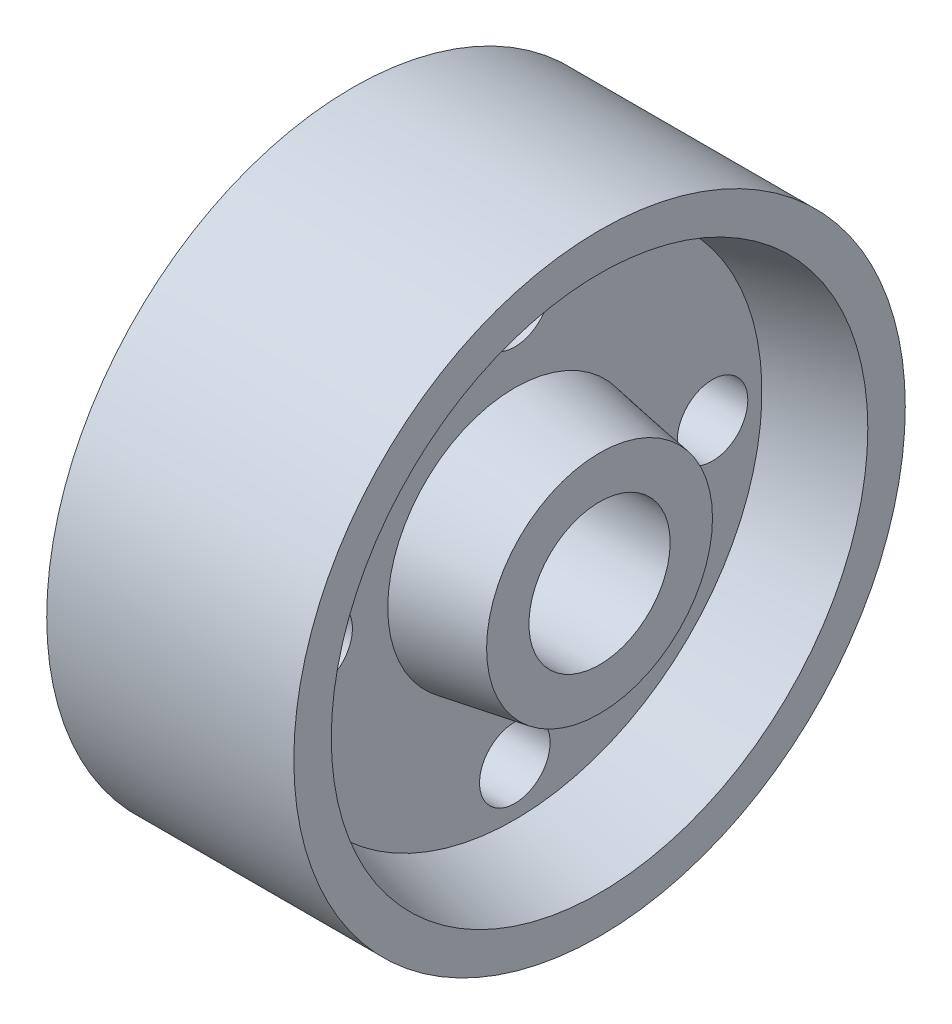
ISO-10303-21;
HEADER;
FILE_DESCRIPTION(('STEP AP214'),'2;1');
FILE_NAME('part.step','',(''),(''),'','','');
FILE_SCHEMA(('AUTOMOTIVE_DESIGN { 1 0 10303 214 1 1 1 1 }'));
ENDSEC;
DATA;
#1=APPLICATION_CONTEXT('core data for automotive mechanical design processes');
#2=APPLICATION_PROTOCOL_DEFINITION('international standard','automotive_design',2000,#1);
#3=PRODUCT_CONTEXT('',#1,'mechanical');
#4=PRODUCT('Part','Part','',(#3));
#5=PRODUCT_RELATED_PRODUCT_CATEGORY('part','',(#4));
#6=PRODUCT_DEFINITION_FORMATION('','',#4);
#7=PRODUCT_DEFINITION_CONTEXT('part definition',#1,'design');
#8=PRODUCT_DEFINITION('design','',#6,#7);
#9=PRODUCT_DEFINITION_SHAPE('','',#8);
#10=(LENGTH_UNIT() NAMED_UNIT(*) SI_UNIT(.MILLI.,.METRE.));
#11=(NAMED_UNIT(*) PLANE_ANGLE_UNIT() SI_UNIT($,.RADIAN.));
#12=(NAMED_UNIT(*) SI_UNIT($,.STERADIAN.) SOLID_ANGLE_UNIT());
#13=UNCERTAINTY_MEASURE_WITH_UNIT(LENGTH_MEASURE(1.E-05),#10,'distance_accuracy_value','');
#14=(GEOMETRIC_REPRESENTATION_CONTEXT(3) GLOBAL_UNCERTAINTY_ASSIGNED_CONTEXT((#13)) GLOBAL_UNIT_ASSIGNED_CONTEXT((#10,
#11,#12)) REPRESENTATION_CONTEXT('',''));
#15=CARTESIAN_POINT('',(0.,0.,0.));
#16=DIRECTION('',(0.,0.,1.));
#17=DIRECTION('',(1.,0.,0.));
#18=AXIS2_PLACEMENT_3D('',#15,#16,#17);
#19=CARTESIAN_POINT('',(35.,0.,0.));
#20=DIRECTION('',(-1.,0.,0.));
#21=DIRECTION('',(0.,0.,1.));
#22=AXIS2_PLACEMENT_3D('',#19,#20,#21);
#23=PLANE('',#22);
#24=CARTESIAN_POINT('',(35.,0.,0.));
#25=DIRECTION('',(1.,0.,0.));
#26=DIRECTION('',(0.,0.,-1.));
#27=AXIS2_PLACEMENT_3D('',#24,#25,#26);
#28=CIRCLE('',#27,10.);
#29=CARTESIAN_POINT('',(35.,0.,-10.));
#30=VERTEX_POINT('',#29);
#31=EDGE_CURVE('E186',#30,#30,#28,.T.);
#32=ORIENTED_EDGE('',*,*,#31,.F.);
#33=EDGE_LOOP('',(#32));
#34=FACE_BOUND('',#33,.T.);
#35=CARTESIAN_POINT('',(35.,0.,0.));
#36=DIRECTION('',(-1.,0.,0.));
#37=DIRECTION('',(0.,0.,1.));
#38=AXIS2_PLACEMENT_3D('',#35,#36,#37);
#39=CIRCLE('',#38,16.);
#40=CARTESIAN_POINT('',(35.,0.,16.));
#41=VERTEX_POINT('',#40);
#42=EDGE_CURVE('E10',#41,#41,#39,.T.);
#43=ORIENTED_EDGE('',*,*,#42,.F.);
#44=EDGE_LOOP('',(#43));
#45=FACE_BOUND('',#44,.T.);
#46=ADVANCED_FACE('F41',(#34,#45),#23,.F.);
#47=CARTESIAN_POINT('',(35.,0.,0.));
#48=DIRECTION('',(-1.,0.,0.));
#49=DIRECTION('',(0.,0.,1.));
#50=AXIS2_PLACEMENT_3D('',#47,#48,#49);
#51=CONICAL_SURFACE('',#50,16.,0.165148677414627);
#52=CARTESIAN_POINT('',(23.,0.,0.));
#53=DIRECTION('',(-1.,0.,0.));
#54=DIRECTION('',(0.,0.,1.));
#55=AXIS2_PLACEMENT_3D('',#52,#53,#54);
#56=CIRCLE('',#55,18.);
#57=CARTESIAN_POINT('',(23.,0.,18.));
#58=VERTEX_POINT('',#57);
#59=EDGE_CURVE('E49',#58,#58,#56,.T.);
#60=ORIENTED_EDGE('',*,*,#59,.F.);
#61=EDGE_LOOP('',(#60));
#62=FACE_BOUND('',#61,.T.);
#63=ORIENTED_EDGE('',*,*,#42,.T.);
#64=EDGE_LOOP('',(#63));
#65=FACE_BOUND('',#64,.T.);
#66=ADVANCED_FACE('F118',(#62,#65),#51,.T.);
#67=CARTESIAN_POINT('',(23.,0.,-18.));
#68=DIRECTION('',(-1.,0.,0.));
#69=DIRECTION('',(0.,0.,1.));
#70=AXIS2_PLACEMENT_3D('',#67,#68,#69);
#71=PLANE('',#70);
#72=CARTESIAN_POINT('',(23.,28.,0.));
#73=DIRECTION('',(1.,0.,0.));
#74=DIRECTION('',(0.,0.,-1.));
#75=AXIS2_PLACEMENT_3D('',#72,#73,#74);
#76=CIRCLE('',#75,5.);
#77=CARTESIAN_POINT('',(23.,28.,-5.));
#78=VERTEX_POINT('',#77);
#79=EDGE_CURVE('E64',#78,#78,#76,.T.);
#80=ORIENTED_EDGE('',*,*,#79,.F.);
#81=EDGE_LOOP('',(#80));
#82=FACE_BOUND('',#81,.T.);
#83=CARTESIAN_POINT('',(23.,0.,-28.));
#84=DIRECTION('',(1.,0.,0.));
#85=DIRECTION('',(0.,0.,-1.));
#86=AXIS2_PLACEMENT_3D('',#83,#84,#85);
#87=CIRCLE('',#86,5.0000000000001);
#88=CARTESIAN_POINT('',(23.,0.,-33.0000000000001));
#89=VERTEX_POINT('',#88);
#90=EDGE_CURVE('E195',#89,#89,#87,.T.);
#91=ORIENTED_EDGE('',*,*,#90,.F.);
#92=EDGE_LOOP('',(#91));
#93=FACE_BOUND('',#92,.T.);
#94=CARTESIAN_POINT('',(23.,-28.,1.95522954975215E-13));
#95=DIRECTION('',(1.,0.,0.));
#96=DIRECTION('',(0.,0.,-1.));
#97=AXIS2_PLACEMENT_3D('',#94,#95,#96);
#98=CIRCLE('',#97,5.);
#99=CARTESIAN_POINT('',(23.,-28.,-4.9999999999998));
#100=VERTEX_POINT('',#99);
#101=EDGE_CURVE('E198',#100,#100,#98,.T.);
#102=ORIENTED_EDGE('',*,*,#101,.F.);
#103=EDGE_LOOP('',(#102));
#104=FACE_BOUND('',#103,.T.);
#105=CARTESIAN_POINT('',(23.,0.,28.));
#106=DIRECTION('',(1.,0.,0.));
#107=DIRECTION('',(0.,0.,-1.));
#108=AXIS2_PLACEMENT_3D('',#105,#106,#107);
#109=CIRCLE('',#108,5.00000000000028);
#110=CARTESIAN_POINT('',(23.,0.,22.9999999999997));
#111=VERTEX_POINT('',#110);
#112=EDGE_CURVE('E88',#111,#111,#109,.T.);
#113=ORIENTED_EDGE('',*,*,#112,.F.);
#114=EDGE_LOOP('',(#113));
#115=FACE_BOUND('',#114,.T.);
#116=CARTESIAN_POINT('',(23.,0.,0.));
#117=DIRECTION('',(-1.,0.,0.));
#118=DIRECTION('',(0.,0.,1.));
#119=AXIS2_PLACEMENT_3D('',#116,#117,#118);
#120=CIRCLE('',#119,35.);
#121=CARTESIAN_POINT('',(23.,0.,35.));
#122=VERTEX_POINT('',#121);
#123=EDGE_CURVE('E55',#122,#122,#120,.T.);
#124=ORIENTED_EDGE('',*,*,#123,.F.);
#125=EDGE_LOOP('',(#124));
#126=FACE_BOUND('',#125,.T.);
#127=ORIENTED_EDGE('',*,*,#59,.T.);
#128=EDGE_LOOP('',(#127));
#129=FACE_BOUND('',#128,.T.);
#130=ADVANCED_FACE('F115',(#82,#93,#104,#115,#126,#129),#71,.F.);
#131=CARTESIAN_POINT('',(23.,0.,0.));
#132=DIRECTION('',(1.,0.,0.));
#133=DIRECTION('',(0.,0.,-1.));
#134=AXIS2_PLACEMENT_3D('',#131,#132,#133);
#135=CONICAL_SURFACE('',#134,35.,0.244978663126864);
#136=CARTESIAN_POINT('',(35.,0.,0.));
#137=DIRECTION('',(-1.,0.,0.));
#138=DIRECTION('',(0.,0.,1.));
#139=AXIS2_PLACEMENT_3D('',#136,#137,#138);
#140=CIRCLE('',#139,38.);
#141=CARTESIAN_POINT('',(35.,0.,38.));
#142=VERTEX_POINT('',#141);
#143=EDGE_CURVE('E106',#142,#142,#140,.T.);
#144=ORIENTED_EDGE('',*,*,#143,.F.);
#145=EDGE_LOOP('',(#144));
#146=FACE_BOUND('',#145,.T.);
#147=ORIENTED_EDGE('',*,*,#123,.T.);
#148=EDGE_LOOP('',(#147));
#149=FACE_BOUND('',#148,.T.);
#150=ADVANCED_FACE('F113',(#146,#149),#135,.F.);
#151=CARTESIAN_POINT('',(35.,0.,-38.));
#152=DIRECTION('',(-1.,0.,0.));
#153=DIRECTION('',(0.,0.,1.));
#154=AXIS2_PLACEMENT_3D('',#151,#152,#153);
#155=PLANE('',#154);
#156=CARTESIAN_POINT('',(35.,0.,0.));
#157=DIRECTION('',(-1.,0.,0.));
#158=DIRECTION('',(0.,0.,1.));
#159=AXIS2_PLACEMENT_3D('',#156,#157,#158);
#160=CIRCLE('',#159,43.3071767281689);
#161=CARTESIAN_POINT('',(35.,0.,43.3071767281689));
#162=VERTEX_POINT('',#161);
#163=EDGE_CURVE('E102',#162,#162,#160,.T.);
#164=ORIENTED_EDGE('',*,*,#163,.F.);
#165=EDGE_LOOP('',(#164));
#166=FACE_BOUND('',#165,.T.);
#167=ORIENTED_EDGE('',*,*,#143,.T.);
#168=EDGE_LOOP('',(#167));
#169=FACE_BOUND('',#168,.T.);
#170=ADVANCED_FACE('F131',(#166,#169),#155,.F.);
#171=CARTESIAN_POINT('',(0.,0.,0.));
#172=DIRECTION('',(-1.,0.,0.));
#173=DIRECTION('',(0.,0.,1.));
#174=AXIS2_PLACEMENT_3D('',#171,#172,#173);
#175=CYLINDRICAL_SURFACE('',#174,43.3071767281689);
#176=CARTESIAN_POINT('',(0.,0.,0.));
#177=DIRECTION('',(-1.,0.,0.));
#178=DIRECTION('',(0.,0.,1.));
#179=AXIS2_PLACEMENT_3D('',#176,#177,#178);
#180=CIRCLE('',#179,43.3071767281689);
#181=CARTESIAN_POINT('',(0.,0.,43.3071767281689));
#182=VERTEX_POINT('',#181);
#183=EDGE_CURVE('E98',#182,#182,#180,.T.);
#184=ORIENTED_EDGE('',*,*,#183,.F.);
#185=EDGE_LOOP('',(#184));
#186=FACE_BOUND('',#185,.T.);
#187=ORIENTED_EDGE('',*,*,#163,.T.);
#188=EDGE_LOOP('',(#187));
#189=FACE_BOUND('',#188,.T.);
#190=ADVANCED_FACE('F135',(#186,#189),#175,.T.);
#191=CARTESIAN_POINT('',(0.,0.,-38.));
#192=DIRECTION('',(1.,0.,0.));
#193=DIRECTION('',(0.,0.,-1.));
#194=AXIS2_PLACEMENT_3D('',#191,#192,#193);
#195=PLANE('',#194);
#196=CARTESIAN_POINT('',(0.,0.,0.));
#197=DIRECTION('',(-1.,0.,0.));
#198=DIRECTION('',(0.,0.,1.));
#199=AXIS2_PLACEMENT_3D('',#196,#197,#198);
#200=CIRCLE('',#199,38.);
#201=CARTESIAN_POINT('',(0.,0.,38.));
#202=VERTEX_POINT('',#201);
#203=EDGE_CURVE('E94',#202,#202,#200,.T.);
#204=ORIENTED_EDGE('',*,*,#203,.F.);
#205=EDGE_LOOP('',(#204));
#206=FACE_BOUND('',#205,.T.);
#207=ORIENTED_EDGE('',*,*,#183,.T.);
#208=EDGE_LOOP('',(#207));
#209=FACE_BOUND('',#208,.T.);
#210=ADVANCED_FACE('F139',(#206,#209),#195,.F.);
#211=CARTESIAN_POINT('',(0.,0.,0.));
#212=DIRECTION('',(-1.,0.,0.));
#213=DIRECTION('',(0.,0.,1.));
#214=AXIS2_PLACEMENT_3D('',#211,#212,#213);
#215=CONICAL_SURFACE('',#214,38.,0.244978663126864);
#216=CARTESIAN_POINT('',(12.,0.,0.));
#217=DIRECTION('',(-1.,0.,0.));
#218=DIRECTION('',(0.,0.,1.));
#219=AXIS2_PLACEMENT_3D('',#216,#217,#218);
#220=CIRCLE('',#219,35.);
#221=CARTESIAN_POINT('',(12.,0.,35.));
#222=VERTEX_POINT('',#221);
#223=EDGE_CURVE('E85',#222,#222,#220,.T.);
#224=ORIENTED_EDGE('',*,*,#223,.F.);
#225=EDGE_LOOP('',(#224));
#226=FACE_BOUND('',#225,.T.);
#227=ORIENTED_EDGE('',*,*,#203,.T.);
#228=EDGE_LOOP('',(#227));
#229=FACE_BOUND('',#228,.T.);
#230=ADVANCED_FACE('F143',(#226,#229),#215,.F.);
#231=CARTESIAN_POINT('',(12.,0.,-18.));
#232=DIRECTION('',(1.,0.,0.));
#233=DIRECTION('',(0.,0.,-1.));
#234=AXIS2_PLACEMENT_3D('',#231,#232,#233);
#235=PLANE('',#234);
#236=CARTESIAN_POINT('',(12.,28.,0.));
#237=DIRECTION('',(1.,0.,0.));
#238=DIRECTION('',(0.,0.,-1.));
#239=AXIS2_PLACEMENT_3D('',#236,#237,#238);
#240=CIRCLE('',#239,5.);
#241=CARTESIAN_POINT('',(12.,28.,-5.));
#242=VERTEX_POINT('',#241);
#243=EDGE_CURVE('E44',#242,#242,#240,.T.);
#244=ORIENTED_EDGE('',*,*,#243,.T.);
#245=EDGE_LOOP('',(#244));
#246=FACE_BOUND('',#245,.T.);
#247=CARTESIAN_POINT('',(12.,0.,-28.));
#248=DIRECTION('',(1.,0.,0.));
#249=DIRECTION('',(0.,0.,-1.));
#250=AXIS2_PLACEMENT_3D('',#247,#248,#249);
#251=CIRCLE('',#250,5.0000000000001);
#252=CARTESIAN_POINT('',(12.,0.,-33.0000000000001));
#253=VERTEX_POINT('',#252);
#254=EDGE_CURVE('E67',#253,#253,#251,.T.);
#255=ORIENTED_EDGE('',*,*,#254,.T.);
#256=EDGE_LOOP('',(#255));
#257=FACE_BOUND('',#256,.T.);
#258=CARTESIAN_POINT('',(12.,-28.,1.95522954975215E-13));
#259=DIRECTION('',(1.,0.,0.));
#260=DIRECTION('',(0.,0.,-1.));
#261=AXIS2_PLACEMENT_3D('',#258,#259,#260);
#262=CIRCLE('',#261,5.);
#263=CARTESIAN_POINT('',(12.,-28.,-4.9999999999998));
#264=VERTEX_POINT('',#263);
#265=EDGE_CURVE('E63',#264,#264,#262,.T.);
#266=ORIENTED_EDGE('',*,*,#265,.T.);
#267=EDGE_LOOP('',(#266));
#268=FACE_BOUND('',#267,.T.);
#269=CARTESIAN_POINT('',(12.,0.,28.));
#270=DIRECTION('',(1.,0.,0.));
#271=DIRECTION('',(0.,0.,-1.));
#272=AXIS2_PLACEMENT_3D('',#269,#270,#271);
#273=CIRCLE('',#272,5.00000000000028);
#274=CARTESIAN_POINT('',(12.,0.,22.9999999999997));
#275=VERTEX_POINT('',#274);
#276=EDGE_CURVE('E59',#275,#275,#273,.T.);
#277=ORIENTED_EDGE('',*,*,#276,.T.);
#278=EDGE_LOOP('',(#277));
#279=FACE_BOUND('',#278,.T.);
#280=CARTESIAN_POINT('',(12.,0.,0.));
#281=DIRECTION('',(-1.,0.,0.));
#282=DIRECTION('',(0.,0.,1.));
#283=AXIS2_PLACEMENT_3D('',#280,#281,#282);
#284=CIRCLE('',#283,18.);
#285=CARTESIAN_POINT('',(12.,0.,18.));
#286=VERTEX_POINT('',#285);
#287=EDGE_CURVE('E79',#286,#286,#284,.T.);
#288=ORIENTED_EDGE('',*,*,#287,.F.);
#289=EDGE_LOOP('',(#288));
#290=FACE_BOUND('',#289,.T.);
#291=ORIENTED_EDGE('',*,*,#223,.T.);
#292=EDGE_LOOP('',(#291));
#293=FACE_BOUND('',#292,.T.);
#294=ADVANCED_FACE('F147',(#246,#257,#268,#279,#290,#293),#235,.F.);
#295=CARTESIAN_POINT('',(12.,0.,0.));
#296=DIRECTION('',(1.,0.,0.));
#297=DIRECTION('',(0.,0.,-1.));
#298=AXIS2_PLACEMENT_3D('',#295,#296,#297);
#299=CONICAL_SURFACE('',#298,18.,0.165148677414627);
#300=CARTESIAN_POINT('',(0.,0.,0.));
#301=DIRECTION('',(-1.,0.,0.));
#302=DIRECTION('',(0.,0.,1.));
#303=AXIS2_PLACEMENT_3D('',#300,#301,#302);
#304=CIRCLE('',#303,16.);
#305=CARTESIAN_POINT('',(0.,0.,16.));
#306=VERTEX_POINT('',#305);
#307=EDGE_CURVE('E74',#306,#306,#304,.T.);
#308=ORIENTED_EDGE('',*,*,#307,.F.);
#309=EDGE_LOOP('',(#308));
#310=FACE_BOUND('',#309,.T.);
#311=ORIENTED_EDGE('',*,*,#287,.T.);
#312=EDGE_LOOP('',(#311));
#313=FACE_BOUND('',#312,.T.);
#314=ADVANCED_FACE('F151',(#310,#313),#299,.T.);
#315=CARTESIAN_POINT('',(0.,0.,0.));
#316=DIRECTION('',(1.,0.,0.));
#317=DIRECTION('',(0.,0.,-1.));
#318=AXIS2_PLACEMENT_3D('',#315,#316,#317);
#319=PLANE('',#318);
#320=CARTESIAN_POINT('',(0.,0.,0.));
#321=DIRECTION('',(1.,0.,0.));
#322=DIRECTION('',(0.,0.,-1.));
#323=AXIS2_PLACEMENT_3D('',#320,#321,#322);
#324=CIRCLE('',#323,10.);
#325=CARTESIAN_POINT('',(0.,0.,-10.));
#326=VERTEX_POINT('',#325);
#327=EDGE_CURVE('E183',#326,#326,#324,.T.);
#328=ORIENTED_EDGE('',*,*,#327,.T.);
#329=EDGE_LOOP('',(#328));
#330=FACE_BOUND('',#329,.T.);
#331=ORIENTED_EDGE('',*,*,#307,.T.);
#332=EDGE_LOOP('',(#331));
#333=FACE_BOUND('',#332,.T.);
#334=ADVANCED_FACE('F154',(#330,#333),#319,.F.);
#335=CARTESIAN_POINT('',(0.,0.,28.));
#336=DIRECTION('',(1.,0.,0.));
#337=DIRECTION('',(0.,0.,-1.));
#338=AXIS2_PLACEMENT_3D('',#335,#336,#337);
#339=CYLINDRICAL_SURFACE('',#338,5.00000000000028);
#340=ORIENTED_EDGE('',*,*,#112,.T.);
#341=EDGE_LOOP('',(#340));
#342=FACE_BOUND('',#341,.T.);
#343=ORIENTED_EDGE('',*,*,#276,.F.);
#344=EDGE_LOOP('',(#343));
#345=FACE_BOUND('',#344,.T.);
#346=ADVANCED_FACE('F158',(#342,#345),#339,.F.);
#347=CARTESIAN_POINT('',(0.,-28.,1.95522954975215E-13));
#348=DIRECTION('',(1.,0.,0.));
#349=DIRECTION('',(0.,0.,-1.));
#350=AXIS2_PLACEMENT_3D('',#347,#348,#349);
#351=CYLINDRICAL_SURFACE('',#350,5.);
#352=ORIENTED_EDGE('',*,*,#101,.T.);
#353=EDGE_LOOP('',(#352));
#354=FACE_BOUND('',#353,.T.);
#355=ORIENTED_EDGE('',*,*,#265,.F.);
#356=EDGE_LOOP('',(#355));
#357=FACE_BOUND('',#356,.T.);
#358=ADVANCED_FACE('F162',(#354,#357),#351,.F.);
#359=CARTESIAN_POINT('',(0.,0.,-28.));
#360=DIRECTION('',(1.,0.,0.));
#361=DIRECTION('',(0.,0.,-1.));
#362=AXIS2_PLACEMENT_3D('',#359,#360,#361);
#363=CYLINDRICAL_SURFACE('',#362,5.0000000000001);
#364=ORIENTED_EDGE('',*,*,#90,.T.);
#365=EDGE_LOOP('',(#364));
#366=FACE_BOUND('',#365,.T.);
#367=ORIENTED_EDGE('',*,*,#254,.F.);
#368=EDGE_LOOP('',(#367));
#369=FACE_BOUND('',#368,.T.);
#370=ADVANCED_FACE('F166',(#366,#369),#363,.F.);
#371=CARTESIAN_POINT('',(0.,28.,0.));
#372=DIRECTION('',(1.,0.,0.));
#373=DIRECTION('',(0.,0.,-1.));
#374=AXIS2_PLACEMENT_3D('',#371,#372,#373);
#375=CYLINDRICAL_SURFACE('',#374,5.);
#376=ORIENTED_EDGE('',*,*,#79,.T.);
#377=EDGE_LOOP('',(#376));
#378=FACE_BOUND('',#377,.T.);
#379=ORIENTED_EDGE('',*,*,#243,.F.);
#380=EDGE_LOOP('',(#379));
#381=FACE_BOUND('',#380,.T.);
#382=ADVANCED_FACE('F170',(#378,#381),#375,.F.);
#383=CARTESIAN_POINT('',(0.,0.,0.));
#384=DIRECTION('',(1.,0.,0.));
#385=DIRECTION('',(0.,0.,-1.));
#386=AXIS2_PLACEMENT_3D('',#383,#384,#385);
#387=CYLINDRICAL_SURFACE('',#386,10.);
#388=ORIENTED_EDGE('',*,*,#327,.F.);
#389=EDGE_LOOP('',(#388));
#390=FACE_BOUND('',#389,.T.);
#391=ORIENTED_EDGE('',*,*,#31,.T.);
#392=EDGE_LOOP('',(#391));
#393=FACE_BOUND('',#392,.T.);
#394=ADVANCED_FACE('F174',(#390,#393),#387,.F.);
#395=CLOSED_SHELL('',(#46,#66,#130,#150,#170,#190,#210,#230,#294,#314,#334,#346,#358,#370,#382,#394));
#396=MANIFOLD_SOLID_BREP('B2',#395);
#397=ADVANCED_BREP_SHAPE_REPRESENTATION('',(#18,#396),#14);
#398=SHAPE_DEFINITION_REPRESENTATION(#9,#397);
ENDSEC;
END-ISO-10303-21;
